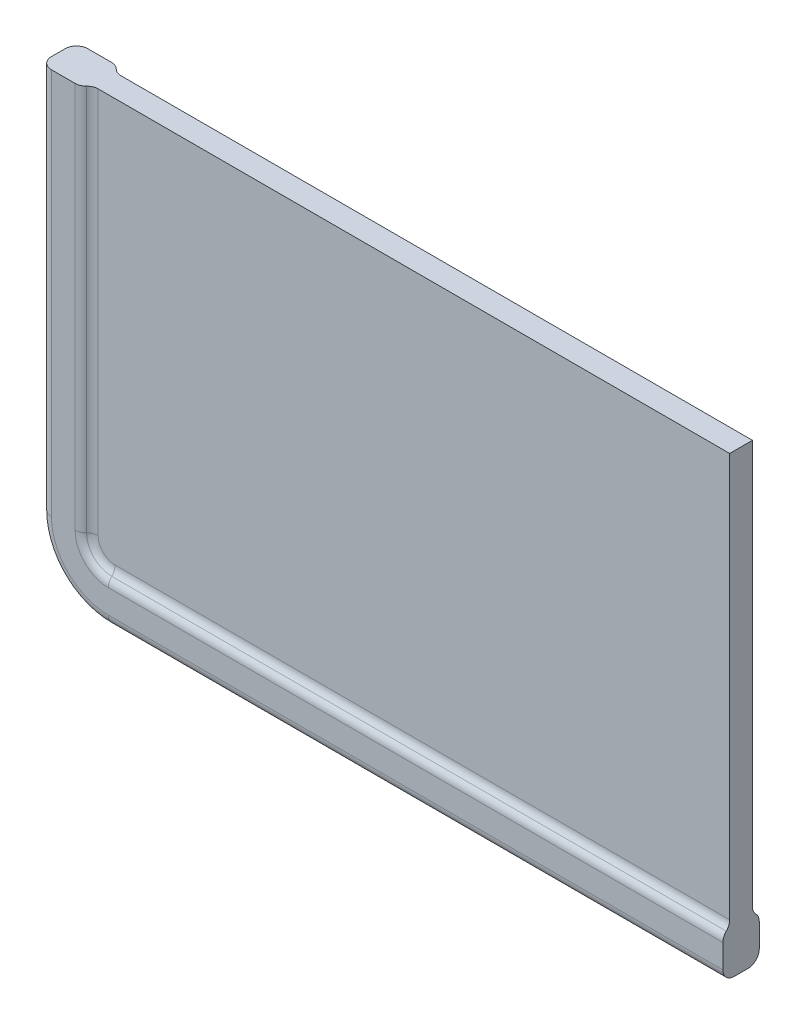
ISO-10303-21;
HEADER;
FILE_DESCRIPTION(('STEP AP214'),'2;1');
FILE_NAME('part.step','',(''),(''),'','','');
FILE_SCHEMA(('AUTOMOTIVE_DESIGN { 1 0 10303 214 1 1 1 1 }'));
ENDSEC;
DATA;
#1=APPLICATION_CONTEXT('core data for automotive mechanical design processes');
#2=APPLICATION_PROTOCOL_DEFINITION('international standard','automotive_design',2000,#1);
#3=PRODUCT_CONTEXT('',#1,'mechanical');
#4=PRODUCT('Part','Part','',(#3));
#5=PRODUCT_RELATED_PRODUCT_CATEGORY('part','',(#4));
#6=PRODUCT_DEFINITION_FORMATION('','',#4);
#7=PRODUCT_DEFINITION_CONTEXT('part definition',#1,'design');
#8=PRODUCT_DEFINITION('design','',#6,#7);
#9=PRODUCT_DEFINITION_SHAPE('','',#8);
#10=(LENGTH_UNIT() NAMED_UNIT(*) SI_UNIT(.MILLI.,.METRE.));
#11=(NAMED_UNIT(*) PLANE_ANGLE_UNIT() SI_UNIT($,.RADIAN.));
#12=(NAMED_UNIT(*) SI_UNIT($,.STERADIAN.) SOLID_ANGLE_UNIT());
#13=UNCERTAINTY_MEASURE_WITH_UNIT(LENGTH_MEASURE(1.E-05),#10,'distance_accuracy_value','');
#14=(GEOMETRIC_REPRESENTATION_CONTEXT(3) GLOBAL_UNCERTAINTY_ASSIGNED_CONTEXT((#13)) GLOBAL_UNIT_ASSIGNED_CONTEXT((#10,
#11,#12)) REPRESENTATION_CONTEXT('',''));
#15=CARTESIAN_POINT('',(0.,0.,0.));
#16=DIRECTION('',(0.,0.,1.));
#17=DIRECTION('',(1.,0.,0.));
#18=AXIS2_PLACEMENT_3D('',#15,#16,#17);
#19=CARTESIAN_POINT('',(0.,0.,0.));
#20=DIRECTION('',(0.,1.,0.));
#21=DIRECTION('',(0.,0.,1.));
#22=AXIS2_PLACEMENT_3D('',#19,#20,#21);
#23=PLANE('',#22);
#24=CARTESIAN_POINT('',(-176.175128514172,0.,6.35));
#25=DIRECTION('',(0.,1.,0.));
#26=DIRECTION('',(0.,0.,1.));
#27=AXIS2_PLACEMENT_3D('',#24,#25,#26);
#28=CIRCLE('',#27,3.175);
#29=CARTESIAN_POINT('',(-178.442532040235,0.,4.12749999999999));
#30=VERTEX_POINT('',#29);
#31=CARTESIAN_POINT('',(-176.175128514172,0.,3.175));
#32=VERTEX_POINT('',#31);
#33=EDGE_CURVE('E221',#30,#32,#28,.F.);
#34=ORIENTED_EDGE('',*,*,#33,.T.);
#35=DIRECTION('',(1.,0.,0.));
#36=VECTOR('',#35,1.);
#37=CARTESIAN_POINT('',(0.,0.,3.175));
#38=LINE('',#37,#36);
#39=CARTESIAN_POINT('',(0.,0.,3.175));
#40=VERTEX_POINT('',#39);
#41=EDGE_CURVE('E223',#32,#40,#38,.T.);
#42=ORIENTED_EDGE('',*,*,#41,.T.);
#43=DIRECTION('',(0.,0.,-1.));
#44=VECTOR('',#43,1.);
#45=CARTESIAN_POINT('',(0.,0.,0.));
#46=LINE('',#45,#44);
#47=CARTESIAN_POINT('',(0.,0.,-3.175));
#48=VERTEX_POINT('',#47);
#49=EDGE_CURVE('E45',#40,#48,#46,.T.);
#50=ORIENTED_EDGE('',*,*,#49,.T.);
#51=DIRECTION('',(1.,0.,0.));
#52=VECTOR('',#51,1.);
#53=CARTESIAN_POINT('',(0.,0.,-3.175));
#54=LINE('',#53,#52);
#55=CARTESIAN_POINT('',(-176.175128514172,0.,-3.175));
#56=VERTEX_POINT('',#55);
#57=EDGE_CURVE('E213',#56,#48,#54,.T.);
#58=ORIENTED_EDGE('',*,*,#57,.F.);
#59=CARTESIAN_POINT('',(-176.175128514172,0.,-6.35));
#60=DIRECTION('',(0.,1.,0.));
#61=DIRECTION('',(0.,0.,1.));
#62=AXIS2_PLACEMENT_3D('',#59,#60,#61);
#63=CIRCLE('',#62,3.175);
#64=CARTESIAN_POINT('',(-178.442532040235,0.,-4.12749999999999));
#65=VERTEX_POINT('',#64);
#66=EDGE_CURVE('E191',#56,#65,#63,.F.);
#67=ORIENTED_EDGE('',*,*,#66,.T.);
#68=CARTESIAN_POINT('',(-180.709935566297,0.,-1.905));
#69=DIRECTION('',(0.,1.,0.));
#70=DIRECTION('',(0.,0.,1.));
#71=AXIS2_PLACEMENT_3D('',#68,#69,#70);
#72=CIRCLE('',#71,3.175);
#73=CARTESIAN_POINT('',(-180.709935566297,0.,-5.08));
#74=VERTEX_POINT('',#73);
#75=EDGE_CURVE('E200',#74,#65,#72,.F.);
#76=ORIENTED_EDGE('',*,*,#75,.F.);
#77=DIRECTION('',(1.,0.,0.));
#78=VECTOR('',#77,1.);
#79=CARTESIAN_POINT('',(171.45,0.,-5.08));
#80=LINE('',#79,#78);
#81=CARTESIAN_POINT('',(-187.325,0.,-5.08));
#82=VERTEX_POINT('',#81);
#83=EDGE_CURVE('E236',#82,#74,#80,.T.);
#84=ORIENTED_EDGE('',*,*,#83,.F.);
#85=CARTESIAN_POINT('',(-187.325,0.,-1.905));
#86=DIRECTION('',(0.,1.,0.));
#87=DIRECTION('',(0.,0.,1.));
#88=AXIS2_PLACEMENT_3D('',#85,#86,#87);
#89=CIRCLE('',#88,3.175);
#90=CARTESIAN_POINT('',(-190.5,0.,-1.905));
#91=VERTEX_POINT('',#90);
#92=EDGE_CURVE('E244',#91,#82,#89,.F.);
#93=ORIENTED_EDGE('',*,*,#92,.F.);
#94=DIRECTION('',(0.,0.,1.));
#95=VECTOR('',#94,1.);
#96=CARTESIAN_POINT('',(-190.5,0.,3.175));
#97=LINE('',#96,#95);
#98=CARTESIAN_POINT('',(-190.5,0.,1.905));
#99=VERTEX_POINT('',#98);
#100=EDGE_CURVE('E227',#91,#99,#97,.T.);
#101=ORIENTED_EDGE('',*,*,#100,.T.);
#102=CARTESIAN_POINT('',(-187.325,0.,1.905));
#103=DIRECTION('',(0.,1.,0.));
#104=DIRECTION('',(0.,0.,1.));
#105=AXIS2_PLACEMENT_3D('',#102,#103,#104);
#106=CIRCLE('',#105,3.175);
#107=CARTESIAN_POINT('',(-187.325,0.,5.08));
#108=VERTEX_POINT('',#107);
#109=EDGE_CURVE('E241',#108,#99,#106,.F.);
#110=ORIENTED_EDGE('',*,*,#109,.F.);
#111=DIRECTION('',(-1.,0.,0.));
#112=VECTOR('',#111,1.);
#113=CARTESIAN_POINT('',(171.45,0.,5.08));
#114=LINE('',#113,#112);
#115=CARTESIAN_POINT('',(-180.709935566297,0.,5.08));
#116=VERTEX_POINT('',#115);
#117=EDGE_CURVE('E232',#116,#108,#114,.T.);
#118=ORIENTED_EDGE('',*,*,#117,.F.);
#119=CARTESIAN_POINT('',(-180.709935566297,0.,1.905));
#120=DIRECTION('',(0.,1.,0.));
#121=DIRECTION('',(0.,0.,1.));
#122=AXIS2_PLACEMENT_3D('',#119,#120,#121);
#123=CIRCLE('',#122,3.175);
#124=EDGE_CURVE('E197',#30,#116,#123,.F.);
#125=ORIENTED_EDGE('',*,*,#124,.F.);
#126=EDGE_LOOP('',(#34,#42,#50,#58,#67,#76,#84,#93,#101,#110,#118,#125));
#127=FACE_BOUND('',#126,.T.);
#128=ADVANCED_FACE('F41',(#127),#23,.T.);
#129=CARTESIAN_POINT('',(0.,0.,0.));
#130=DIRECTION('',(1.,0.,0.));
#131=DIRECTION('',(0.,0.,-1.));
#132=AXIS2_PLACEMENT_3D('',#129,#130,#131);
#133=PLANE('',#132);
#134=ORIENTED_EDGE('',*,*,#49,.F.);
#135=DIRECTION('',(0.,-1.,0.));
#136=VECTOR('',#135,1.);
#137=CARTESIAN_POINT('',(0.,0.,3.175));
#138=LINE('',#137,#136);
#139=CARTESIAN_POINT('',(0.,-112.675128514172,3.175));
#140=VERTEX_POINT('',#139);
#141=EDGE_CURVE('E226',#40,#140,#138,.T.);
#142=ORIENTED_EDGE('',*,*,#141,.T.);
#143=CARTESIAN_POINT('',(0.,-112.675128514172,6.35));
#144=DIRECTION('',(1.,0.,0.));
#145=DIRECTION('',(0.,0.,-1.));
#146=AXIS2_PLACEMENT_3D('',#143,#144,#145);
#147=CIRCLE('',#146,3.175);
#148=CARTESIAN_POINT('',(0.,-114.942532040235,4.1275));
#149=VERTEX_POINT('',#148);
#150=EDGE_CURVE('E217',#140,#149,#147,.F.);
#151=ORIENTED_EDGE('',*,*,#150,.T.);
#152=CARTESIAN_POINT('',(0.,-117.209935566297,1.905));
#153=DIRECTION('',(1.,0.,0.));
#154=DIRECTION('',(0.,0.,-1.));
#155=AXIS2_PLACEMENT_3D('',#152,#153,#154);
#156=CIRCLE('',#155,3.175);
#157=CARTESIAN_POINT('',(0.,-117.209935566297,5.08));
#158=VERTEX_POINT('',#157);
#159=EDGE_CURVE('E206',#158,#149,#156,.F.);
#160=ORIENTED_EDGE('',*,*,#159,.F.);
#161=DIRECTION('',(0.,1.,0.));
#162=VECTOR('',#161,1.);
#163=CARTESIAN_POINT('',(0.,107.95,5.08));
#164=LINE('',#163,#162);
#165=CARTESIAN_POINT('',(0.,-123.825,5.08));
#166=VERTEX_POINT('',#165);
#167=EDGE_CURVE('E230',#166,#158,#164,.T.);
#168=ORIENTED_EDGE('',*,*,#167,.F.);
#169=CARTESIAN_POINT('',(0.,-123.825,1.905));
#170=DIRECTION('',(1.,0.,0.));
#171=DIRECTION('',(0.,0.,-1.));
#172=AXIS2_PLACEMENT_3D('',#169,#170,#171);
#173=CIRCLE('',#172,3.175);
#174=CARTESIAN_POINT('',(0.,-127.,1.905));
#175=VERTEX_POINT('',#174);
#176=EDGE_CURVE('E240',#175,#166,#173,.F.);
#177=ORIENTED_EDGE('',*,*,#176,.F.);
#178=DIRECTION('',(0.,0.,-1.));
#179=VECTOR('',#178,1.);
#180=CARTESIAN_POINT('',(0.,-127.,3.175));
#181=LINE('',#180,#179);
#182=CARTESIAN_POINT('',(0.,-127.,-1.905));
#183=VERTEX_POINT('',#182);
#184=EDGE_CURVE('E231',#175,#183,#181,.T.);
#185=ORIENTED_EDGE('',*,*,#184,.T.);
#186=CARTESIAN_POINT('',(0.,-123.825,-1.905));
#187=DIRECTION('',(1.,0.,0.));
#188=DIRECTION('',(0.,0.,-1.));
#189=AXIS2_PLACEMENT_3D('',#186,#187,#188);
#190=CIRCLE('',#189,3.175);
#191=CARTESIAN_POINT('',(0.,-123.825,-5.08));
#192=VERTEX_POINT('',#191);
#193=EDGE_CURVE('E243',#192,#183,#190,.F.);
#194=ORIENTED_EDGE('',*,*,#193,.F.);
#195=DIRECTION('',(0.,-1.,0.));
#196=VECTOR('',#195,1.);
#197=CARTESIAN_POINT('',(0.,107.95,-5.08));
#198=LINE('',#197,#196);
#199=CARTESIAN_POINT('',(0.,-117.209935566297,-5.08));
#200=VERTEX_POINT('',#199);
#201=EDGE_CURVE('E235',#200,#192,#198,.T.);
#202=ORIENTED_EDGE('',*,*,#201,.F.);
#203=CARTESIAN_POINT('',(0.,-117.209935566297,-1.905));
#204=DIRECTION('',(1.,0.,0.));
#205=DIRECTION('',(0.,0.,-1.));
#206=AXIS2_PLACEMENT_3D('',#203,#204,#205);
#207=CIRCLE('',#206,3.175);
#208=CARTESIAN_POINT('',(0.,-114.942532040235,-4.1275));
#209=VERTEX_POINT('',#208);
#210=EDGE_CURVE('E207',#209,#200,#207,.F.);
#211=ORIENTED_EDGE('',*,*,#210,.F.);
#212=CARTESIAN_POINT('',(0.,-112.675128514172,-6.35));
#213=DIRECTION('',(1.,0.,0.));
#214=DIRECTION('',(0.,0.,-1.));
#215=AXIS2_PLACEMENT_3D('',#212,#213,#214);
#216=CIRCLE('',#215,3.175);
#217=CARTESIAN_POINT('',(0.,-112.675128514172,-3.175));
#218=VERTEX_POINT('',#217);
#219=EDGE_CURVE('E214',#209,#218,#216,.F.);
#220=ORIENTED_EDGE('',*,*,#219,.T.);
#221=DIRECTION('',(0.,-1.,0.));
#222=VECTOR('',#221,1.);
#223=CARTESIAN_POINT('',(0.,0.,-3.175));
#224=LINE('',#223,#222);
#225=EDGE_CURVE('E238',#48,#218,#224,.T.);
#226=ORIENTED_EDGE('',*,*,#225,.F.);
#227=EDGE_LOOP('',(#134,#142,#151,#160,#168,#177,#185,#194,#202,#211,#220,#226));
#228=FACE_BOUND('',#227,.T.);
#229=ADVANCED_FACE('F379',(#228),#133,.T.);
#230=CARTESIAN_POINT('',(-190.5,-127.,3.175));
#231=DIRECTION('',(1.,0.,0.));
#232=DIRECTION('',(0.,0.,-1.));
#233=AXIS2_PLACEMENT_3D('',#230,#231,#232);
#234=PLANE('',#233);
#235=ORIENTED_EDGE('',*,*,#100,.F.);
#236=DIRECTION('',(0.,-1.,0.));
#237=VECTOR('',#236,1.);
#238=CARTESIAN_POINT('',(-190.5,-107.95,-1.905));
#239=LINE('',#238,#237);
#240=CARTESIAN_POINT('',(-190.5,-107.95,-1.905));
#241=VERTEX_POINT('',#240);
#242=EDGE_CURVE('E306',#91,#241,#239,.T.);
#243=ORIENTED_EDGE('',*,*,#242,.T.);
#244=DIRECTION('',(0.,0.,-1.));
#245=VECTOR('',#244,1.);
#246=CARTESIAN_POINT('',(-190.5,-107.95,3.175));
#247=LINE('',#246,#245);
#248=CARTESIAN_POINT('',(-190.5,-107.95,1.905));
#249=VERTEX_POINT('',#248);
#250=EDGE_CURVE('E304',#241,#249,#247,.F.);
#251=ORIENTED_EDGE('',*,*,#250,.T.);
#252=DIRECTION('',(0.,-1.,0.));
#253=VECTOR('',#252,1.);
#254=CARTESIAN_POINT('',(-190.5,95.25,1.905));
#255=LINE('',#254,#253);
#256=EDGE_CURVE('E309',#249,#99,#255,.F.);
#257=ORIENTED_EDGE('',*,*,#256,.T.);
#258=EDGE_LOOP('',(#235,#243,#251,#257));
#259=FACE_BOUND('',#258,.T.);
#260=ADVANCED_FACE('F400',(#259),#234,.F.);
#261=CARTESIAN_POINT('',(-190.5,-127.,3.175));
#262=DIRECTION('',(0.,1.,0.));
#263=DIRECTION('',(0.,0.,1.));
#264=AXIS2_PLACEMENT_3D('',#261,#262,#263);
#265=PLANE('',#264);
#266=ORIENTED_EDGE('',*,*,#184,.F.);
#267=DIRECTION('',(1.,0.,0.));
#268=VECTOR('',#267,1.);
#269=CARTESIAN_POINT('',(-171.45,-127.,1.905));
#270=LINE('',#269,#268);
#271=CARTESIAN_POINT('',(-171.45,-127.,1.905));
#272=VERTEX_POINT('',#271);
#273=EDGE_CURVE('E290',#175,#272,#270,.F.);
#274=ORIENTED_EDGE('',*,*,#273,.T.);
#275=DIRECTION('',(0.,0.,-1.));
#276=VECTOR('',#275,1.);
#277=CARTESIAN_POINT('',(-171.45,-127.,3.175));
#278=LINE('',#277,#276);
#279=CARTESIAN_POINT('',(-171.45,-127.,-1.905));
#280=VERTEX_POINT('',#279);
#281=EDGE_CURVE('E255',#272,#280,#278,.T.);
#282=ORIENTED_EDGE('',*,*,#281,.T.);
#283=DIRECTION('',(1.,0.,0.));
#284=VECTOR('',#283,1.);
#285=CARTESIAN_POINT('',(158.75,-127.,-1.905));
#286=LINE('',#285,#284);
#287=EDGE_CURVE('E292',#280,#183,#286,.T.);
#288=ORIENTED_EDGE('',*,*,#287,.T.);
#289=EDGE_LOOP('',(#266,#274,#282,#288));
#290=FACE_BOUND('',#289,.T.);
#291=ADVANCED_FACE('F363',(#290),#265,.F.);
#292=CARTESIAN_POINT('',(171.45,107.95,5.08));
#293=DIRECTION('',(0.,0.,1.));
#294=DIRECTION('',(1.,0.,0.));
#295=AXIS2_PLACEMENT_3D('',#292,#293,#294);
#296=PLANE('',#295);
#297=DIRECTION('',(1.,0.,0.));
#298=VECTOR('',#297,1.);
#299=CARTESIAN_POINT('',(158.75,-123.825,5.08));
#300=LINE('',#299,#298);
#301=CARTESIAN_POINT('',(-171.45,-123.825,5.08));
#302=VERTEX_POINT('',#301);
#303=EDGE_CURVE('E296',#302,#166,#300,.T.);
#304=ORIENTED_EDGE('',*,*,#303,.T.);
#305=ORIENTED_EDGE('',*,*,#167,.T.);
#306=DIRECTION('',(1.,0.,0.));
#307=VECTOR('',#306,1.);
#308=CARTESIAN_POINT('',(-171.45,-117.209935566297,5.08));
#309=LINE('',#308,#307);
#310=CARTESIAN_POINT('',(-171.45,-117.209935566297,5.08));
#311=VERTEX_POINT('',#310);
#312=EDGE_CURVE('E63',#158,#311,#309,.F.);
#313=ORIENTED_EDGE('',*,*,#312,.T.);
#314=CARTESIAN_POINT('',(-171.45,-107.95,5.08));
#315=DIRECTION('',(0.,0.,1.));
#316=DIRECTION('',(1.,0.,0.));
#317=AXIS2_PLACEMENT_3D('',#314,#315,#316);
#318=CIRCLE('',#317,9.25993556629697);
#319=CARTESIAN_POINT('',(-180.709935566297,-107.95,5.08));
#320=VERTEX_POINT('',#319);
#321=EDGE_CURVE('E58',#311,#320,#318,.F.);
#322=ORIENTED_EDGE('',*,*,#321,.T.);
#323=DIRECTION('',(0.,-1.,0.));
#324=VECTOR('',#323,1.);
#325=CARTESIAN_POINT('',(-180.709935566297,95.25,5.08));
#326=LINE('',#325,#324);
#327=EDGE_CURVE('E302',#320,#116,#326,.F.);
#328=ORIENTED_EDGE('',*,*,#327,.T.);
#329=ORIENTED_EDGE('',*,*,#117,.T.);
#330=DIRECTION('',(0.,-1.,0.));
#331=VECTOR('',#330,1.);
#332=CARTESIAN_POINT('',(-187.325,-107.95,5.08));
#333=LINE('',#332,#331);
#334=CARTESIAN_POINT('',(-187.325,-107.95,5.08));
#335=VERTEX_POINT('',#334);
#336=EDGE_CURVE('E301',#108,#335,#333,.T.);
#337=ORIENTED_EDGE('',*,*,#336,.T.);
#338=CARTESIAN_POINT('',(-171.45,-107.95,5.08));
#339=DIRECTION('',(0.,0.,1.));
#340=DIRECTION('',(1.,0.,0.));
#341=AXIS2_PLACEMENT_3D('',#338,#339,#340);
#342=CIRCLE('',#341,15.875);
#343=EDGE_CURVE('E299',#335,#302,#342,.T.);
#344=ORIENTED_EDGE('',*,*,#343,.T.);
#345=EDGE_LOOP('',(#304,#305,#313,#322,#328,#329,#337,#344));
#346=FACE_BOUND('',#345,.T.);
#347=ADVANCED_FACE('F407',(#346),#296,.T.);
#348=CARTESIAN_POINT('',(0.,0.,3.175));
#349=DIRECTION('',(0.,0.,-1.));
#350=DIRECTION('',(-1.,0.,0.));
#351=AXIS2_PLACEMENT_3D('',#348,#349,#350);
#352=PLANE('',#351);
#353=ORIENTED_EDGE('',*,*,#141,.F.);
#354=ORIENTED_EDGE('',*,*,#41,.F.);
#355=DIRECTION('',(0.,1.,0.));
#356=VECTOR('',#355,1.);
#357=CARTESIAN_POINT('',(-176.175128514172,0.,3.175));
#358=LINE('',#357,#356);
#359=CARTESIAN_POINT('',(-176.175128514172,-107.95,3.175));
#360=VERTEX_POINT('',#359);
#361=EDGE_CURVE('E284',#32,#360,#358,.F.);
#362=ORIENTED_EDGE('',*,*,#361,.T.);
#363=CARTESIAN_POINT('',(-171.45,-107.95,3.175));
#364=DIRECTION('',(0.,0.,-1.));
#365=DIRECTION('',(-1.,0.,0.));
#366=AXIS2_PLACEMENT_3D('',#363,#364,#365);
#367=CIRCLE('',#366,4.72512851417226);
#368=CARTESIAN_POINT('',(-171.45,-112.675128514172,3.175));
#369=VERTEX_POINT('',#368);
#370=EDGE_CURVE('E280',#360,#369,#367,.F.);
#371=ORIENTED_EDGE('',*,*,#370,.T.);
#372=DIRECTION('',(-1.,0.,0.));
#373=VECTOR('',#372,1.);
#374=CARTESIAN_POINT('',(0.,-112.675128514172,3.175));
#375=LINE('',#374,#373);
#376=EDGE_CURVE('E277',#369,#140,#375,.F.);
#377=ORIENTED_EDGE('',*,*,#376,.T.);
#378=EDGE_LOOP('',(#353,#354,#362,#371,#377));
#379=FACE_BOUND('',#378,.T.);
#380=ADVANCED_FACE('F43',(#379),#352,.F.);
#381=CARTESIAN_POINT('',(171.45,107.95,-5.08));
#382=DIRECTION('',(0.,0.,-1.));
#383=DIRECTION('',(1.,0.,0.));
#384=AXIS2_PLACEMENT_3D('',#381,#382,#383);
#385=PLANE('',#384);
#386=DIRECTION('',(-1.,0.,0.));
#387=VECTOR('',#386,1.);
#388=CARTESIAN_POINT('',(158.75,-117.209935566297,-5.08));
#389=LINE('',#388,#387);
#390=CARTESIAN_POINT('',(-171.45,-117.209935566297,-5.08));
#391=VERTEX_POINT('',#390);
#392=EDGE_CURVE('E285',#391,#200,#389,.F.);
#393=ORIENTED_EDGE('',*,*,#392,.T.);
#394=ORIENTED_EDGE('',*,*,#201,.T.);
#395=DIRECTION('',(1.,0.,0.));
#396=VECTOR('',#395,1.);
#397=CARTESIAN_POINT('',(-171.45,-123.825,-5.08));
#398=LINE('',#397,#396);
#399=CARTESIAN_POINT('',(-171.45,-123.825,-5.08));
#400=VERTEX_POINT('',#399);
#401=EDGE_CURVE('E281',#192,#400,#398,.F.);
#402=ORIENTED_EDGE('',*,*,#401,.T.);
#403=CARTESIAN_POINT('',(-171.45,-107.95,-5.08));
#404=DIRECTION('',(0.,0.,-1.));
#405=DIRECTION('',(-1.,0.,0.));
#406=AXIS2_PLACEMENT_3D('',#403,#404,#405);
#407=CIRCLE('',#406,15.875);
#408=CARTESIAN_POINT('',(-187.325,-107.95,-5.08));
#409=VERTEX_POINT('',#408);
#410=EDGE_CURVE('E283',#400,#409,#407,.T.);
#411=ORIENTED_EDGE('',*,*,#410,.T.);
#412=DIRECTION('',(0.,-1.,0.));
#413=VECTOR('',#412,1.);
#414=CARTESIAN_POINT('',(-187.325,95.25,-5.08));
#415=LINE('',#414,#413);
#416=EDGE_CURVE('E289',#409,#82,#415,.F.);
#417=ORIENTED_EDGE('',*,*,#416,.T.);
#418=ORIENTED_EDGE('',*,*,#83,.T.);
#419=DIRECTION('',(0.,1.,0.));
#420=VECTOR('',#419,1.);
#421=CARTESIAN_POINT('',(-180.709935566297,-107.95,-5.08));
#422=LINE('',#421,#420);
#423=CARTESIAN_POINT('',(-180.709935566297,-107.95,-5.08));
#424=VERTEX_POINT('',#423);
#425=EDGE_CURVE('E202',#74,#424,#422,.F.);
#426=ORIENTED_EDGE('',*,*,#425,.T.);
#427=CARTESIAN_POINT('',(-171.45,-107.95,-5.08));
#428=DIRECTION('',(0.,0.,-1.));
#429=DIRECTION('',(-1.,0.,0.));
#430=AXIS2_PLACEMENT_3D('',#427,#428,#429);
#431=CIRCLE('',#430,9.25993556629697);
#432=EDGE_CURVE('E288',#424,#391,#431,.F.);
#433=ORIENTED_EDGE('',*,*,#432,.T.);
#434=EDGE_LOOP('',(#393,#394,#402,#411,#417,#418,#426,#433));
#435=FACE_BOUND('',#434,.T.);
#436=ADVANCED_FACE('F434',(#435),#385,.T.);
#437=CARTESIAN_POINT('',(0.,0.,-3.175));
#438=DIRECTION('',(0.,0.,-1.));
#439=DIRECTION('',(-1.,0.,0.));
#440=AXIS2_PLACEMENT_3D('',#437,#438,#439);
#441=PLANE('',#440);
#442=ORIENTED_EDGE('',*,*,#57,.T.);
#443=ORIENTED_EDGE('',*,*,#225,.T.);
#444=DIRECTION('',(-1.,0.,0.));
#445=VECTOR('',#444,1.);
#446=CARTESIAN_POINT('',(-171.45,-112.675128514172,-3.175));
#447=LINE('',#446,#445);
#448=CARTESIAN_POINT('',(-171.45,-112.675128514172,-3.175));
#449=VERTEX_POINT('',#448);
#450=EDGE_CURVE('E272',#218,#449,#447,.T.);
#451=ORIENTED_EDGE('',*,*,#450,.T.);
#452=CARTESIAN_POINT('',(-171.45,-107.95,-3.175));
#453=DIRECTION('',(0.,0.,-1.));
#454=DIRECTION('',(-1.,0.,0.));
#455=AXIS2_PLACEMENT_3D('',#452,#453,#454);
#456=CIRCLE('',#455,4.72512851417226);
#457=CARTESIAN_POINT('',(-176.175128514172,-107.95,-3.175));
#458=VERTEX_POINT('',#457);
#459=EDGE_CURVE('E274',#449,#458,#456,.T.);
#460=ORIENTED_EDGE('',*,*,#459,.T.);
#461=DIRECTION('',(0.,1.,0.));
#462=VECTOR('',#461,1.);
#463=CARTESIAN_POINT('',(-176.175128514172,95.25,-3.175));
#464=LINE('',#463,#462);
#465=EDGE_CURVE('E317',#458,#56,#464,.T.);
#466=ORIENTED_EDGE('',*,*,#465,.T.);
#467=EDGE_LOOP('',(#442,#443,#451,#460,#466));
#468=FACE_BOUND('',#467,.T.);
#469=ADVANCED_FACE('F437',(#468),#441,.T.);
#470=CARTESIAN_POINT('',(171.45,-123.825,1.905));
#471=DIRECTION('',(-1.,0.,0.));
#472=DIRECTION('',(0.,0.,1.));
#473=AXIS2_PLACEMENT_3D('',#470,#471,#472);
#474=CYLINDRICAL_SURFACE('',#473,3.175);
#475=ORIENTED_EDGE('',*,*,#273,.F.);
#476=ORIENTED_EDGE('',*,*,#176,.T.);
#477=ORIENTED_EDGE('',*,*,#303,.F.);
#478=CARTESIAN_POINT('',(-171.45,-123.825,1.905));
#479=DIRECTION('',(1.,0.,0.));
#480=DIRECTION('',(0.,0.,-1.));
#481=AXIS2_PLACEMENT_3D('',#478,#479,#480);
#482=CIRCLE('',#481,3.175);
#483=EDGE_CURVE('E344',#302,#272,#482,.T.);
#484=ORIENTED_EDGE('',*,*,#483,.T.);
#485=EDGE_LOOP('',(#475,#476,#477,#484));
#486=FACE_BOUND('',#485,.T.);
#487=ADVANCED_FACE('F382',(#486),#474,.T.);
#488=CARTESIAN_POINT('',(-187.325,107.95,1.905));
#489=DIRECTION('',(0.,1.,0.));
#490=DIRECTION('',(0.,0.,1.));
#491=AXIS2_PLACEMENT_3D('',#488,#489,#490);
#492=CYLINDRICAL_SURFACE('',#491,3.175);
#493=ORIENTED_EDGE('',*,*,#336,.F.);
#494=ORIENTED_EDGE('',*,*,#109,.T.);
#495=ORIENTED_EDGE('',*,*,#256,.F.);
#496=CARTESIAN_POINT('',(-187.325,-107.95,1.905));
#497=DIRECTION('',(0.,1.,0.));
#498=DIRECTION('',(0.,0.,1.));
#499=AXIS2_PLACEMENT_3D('',#496,#497,#498);
#500=CIRCLE('',#499,3.175);
#501=EDGE_CURVE('E341',#249,#335,#500,.T.);
#502=ORIENTED_EDGE('',*,*,#501,.T.);
#503=EDGE_LOOP('',(#493,#494,#495,#502));
#504=FACE_BOUND('',#503,.T.);
#505=ADVANCED_FACE('F427',(#504),#492,.T.);
#506=CARTESIAN_POINT('',(-190.5,-123.825,-1.905));
#507=DIRECTION('',(-1.,0.,0.));
#508=DIRECTION('',(0.,0.,1.));
#509=AXIS2_PLACEMENT_3D('',#506,#507,#508);
#510=CYLINDRICAL_SURFACE('',#509,3.175);
#511=ORIENTED_EDGE('',*,*,#401,.F.);
#512=ORIENTED_EDGE('',*,*,#193,.T.);
#513=ORIENTED_EDGE('',*,*,#287,.F.);
#514=CARTESIAN_POINT('',(-171.45,-123.825,-1.905));
#515=DIRECTION('',(1.,0.,0.));
#516=DIRECTION('',(0.,0.,-1.));
#517=AXIS2_PLACEMENT_3D('',#514,#515,#516);
#518=CIRCLE('',#517,3.175);
#519=EDGE_CURVE('E338',#280,#400,#518,.T.);
#520=ORIENTED_EDGE('',*,*,#519,.T.);
#521=EDGE_LOOP('',(#511,#512,#513,#520));
#522=FACE_BOUND('',#521,.T.);
#523=ADVANCED_FACE('F375',(#522),#510,.T.);
#524=CARTESIAN_POINT('',(-187.325,-127.,-1.905));
#525=DIRECTION('',(0.,1.,0.));
#526=DIRECTION('',(0.,0.,1.));
#527=AXIS2_PLACEMENT_3D('',#524,#525,#526);
#528=CYLINDRICAL_SURFACE('',#527,3.175);
#529=ORIENTED_EDGE('',*,*,#242,.F.);
#530=ORIENTED_EDGE('',*,*,#92,.T.);
#531=ORIENTED_EDGE('',*,*,#416,.F.);
#532=CARTESIAN_POINT('',(-187.325,-107.95,-1.905));
#533=DIRECTION('',(0.,1.,0.));
#534=DIRECTION('',(0.,0.,1.));
#535=AXIS2_PLACEMENT_3D('',#532,#533,#534);
#536=CIRCLE('',#535,3.175);
#537=EDGE_CURVE('E336',#409,#241,#536,.T.);
#538=ORIENTED_EDGE('',*,*,#537,.T.);
#539=EDGE_LOOP('',(#529,#530,#531,#538));
#540=FACE_BOUND('',#539,.T.);
#541=ADVANCED_FACE('F413',(#540),#528,.T.);
#542=CARTESIAN_POINT('',(-171.45,-117.209935566297,-1.905));
#543=DIRECTION('',(1.,0.,0.));
#544=DIRECTION('',(0.,0.,-1.));
#545=AXIS2_PLACEMENT_3D('',#542,#543,#544);
#546=CYLINDRICAL_SURFACE('',#545,3.175);
#547=DIRECTION('',(1.,0.,0.));
#548=VECTOR('',#547,1.);
#549=CARTESIAN_POINT('',(-171.45,-114.942532040235,-4.1275));
#550=LINE('',#549,#548);
#551=CARTESIAN_POINT('',(-171.45,-114.942532040235,-4.1275));
#552=VERTEX_POINT('',#551);
#553=EDGE_CURVE('E270',#552,#209,#550,.T.);
#554=ORIENTED_EDGE('',*,*,#553,.T.);
#555=ORIENTED_EDGE('',*,*,#210,.T.);
#556=ORIENTED_EDGE('',*,*,#392,.F.);
#557=CARTESIAN_POINT('',(-171.45,-117.209935566297,-1.905));
#558=DIRECTION('',(1.,0.,0.));
#559=DIRECTION('',(0.,0.,-1.));
#560=AXIS2_PLACEMENT_3D('',#557,#558,#559);
#561=CIRCLE('',#560,3.175);
#562=EDGE_CURVE('E333',#391,#552,#561,.T.);
#563=ORIENTED_EDGE('',*,*,#562,.T.);
#564=EDGE_LOOP('',(#554,#555,#556,#563));
#565=FACE_BOUND('',#564,.T.);
#566=ADVANCED_FACE('F416',(#565),#546,.T.);
#567=CARTESIAN_POINT('',(-180.709935566297,95.25,-1.905));
#568=DIRECTION('',(0.,-1.,0.));
#569=DIRECTION('',(0.,0.,-1.));
#570=AXIS2_PLACEMENT_3D('',#567,#568,#569);
#571=CYLINDRICAL_SURFACE('',#570,3.175);
#572=ORIENTED_EDGE('',*,*,#425,.F.);
#573=ORIENTED_EDGE('',*,*,#75,.T.);
#574=DIRECTION('',(0.,-1.,0.));
#575=VECTOR('',#574,1.);
#576=CARTESIAN_POINT('',(-178.442532040235,95.25,-4.12749999999999));
#577=LINE('',#576,#575);
#578=CARTESIAN_POINT('',(-178.442532040235,-107.95,-4.12750000000001));
#579=VERTEX_POINT('',#578);
#580=EDGE_CURVE('E186',#65,#579,#577,.T.);
#581=ORIENTED_EDGE('',*,*,#580,.T.);
#582=CARTESIAN_POINT('',(-180.709935566297,-107.95,-1.905));
#583=DIRECTION('',(0.,1.,0.));
#584=DIRECTION('',(0.,0.,1.));
#585=AXIS2_PLACEMENT_3D('',#582,#583,#584);
#586=CIRCLE('',#585,3.175);
#587=EDGE_CURVE('E329',#579,#424,#586,.T.);
#588=ORIENTED_EDGE('',*,*,#587,.T.);
#589=EDGE_LOOP('',(#572,#573,#581,#588));
#590=FACE_BOUND('',#589,.T.);
#591=ADVANCED_FACE('F201',(#590),#571,.T.);
#592=CARTESIAN_POINT('',(-171.45,-117.209935566297,1.905));
#593=DIRECTION('',(-1.,0.,0.));
#594=DIRECTION('',(0.,0.,1.));
#595=AXIS2_PLACEMENT_3D('',#592,#593,#594);
#596=CYLINDRICAL_SURFACE('',#595,3.175);
#597=ORIENTED_EDGE('',*,*,#312,.F.);
#598=ORIENTED_EDGE('',*,*,#159,.T.);
#599=DIRECTION('',(-1.,0.,0.));
#600=VECTOR('',#599,1.);
#601=CARTESIAN_POINT('',(-171.45,-114.942532040235,4.1275));
#602=LINE('',#601,#600);
#603=CARTESIAN_POINT('',(-171.45,-114.942532040235,4.12750000000001));
#604=VERTEX_POINT('',#603);
#605=EDGE_CURVE('E275',#149,#604,#602,.T.);
#606=ORIENTED_EDGE('',*,*,#605,.T.);
#607=CARTESIAN_POINT('',(-171.45,-117.209935566297,1.905));
#608=DIRECTION('',(1.,0.,0.));
#609=DIRECTION('',(0.,0.,-1.));
#610=AXIS2_PLACEMENT_3D('',#607,#608,#609);
#611=CIRCLE('',#610,3.175);
#612=EDGE_CURVE('E326',#604,#311,#611,.T.);
#613=ORIENTED_EDGE('',*,*,#612,.T.);
#614=EDGE_LOOP('',(#597,#598,#606,#613));
#615=FACE_BOUND('',#614,.T.);
#616=ADVANCED_FACE('F422',(#615),#596,.T.);
#617=CARTESIAN_POINT('',(-180.709935566297,95.25,1.905));
#618=DIRECTION('',(0.,1.,0.));
#619=DIRECTION('',(0.,0.,1.));
#620=AXIS2_PLACEMENT_3D('',#617,#618,#619);
#621=CYLINDRICAL_SURFACE('',#620,3.175);
#622=DIRECTION('',(0.,1.,0.));
#623=VECTOR('',#622,1.);
#624=CARTESIAN_POINT('',(-178.442532040235,95.25,4.12749999999999));
#625=LINE('',#624,#623);
#626=CARTESIAN_POINT('',(-178.442532040235,-107.95,4.12749999999999));
#627=VERTEX_POINT('',#626);
#628=EDGE_CURVE('E316',#627,#30,#625,.T.);
#629=ORIENTED_EDGE('',*,*,#628,.T.);
#630=ORIENTED_EDGE('',*,*,#124,.T.);
#631=ORIENTED_EDGE('',*,*,#327,.F.);
#632=CARTESIAN_POINT('',(-180.709935566297,-107.95,1.905));
#633=DIRECTION('',(0.,1.,0.));
#634=DIRECTION('',(0.,0.,1.));
#635=AXIS2_PLACEMENT_3D('',#632,#633,#634);
#636=CIRCLE('',#635,3.175);
#637=EDGE_CURVE('E328',#320,#627,#636,.T.);
#638=ORIENTED_EDGE('',*,*,#637,.T.);
#639=EDGE_LOOP('',(#629,#630,#631,#638));
#640=FACE_BOUND('',#639,.T.);
#641=ADVANCED_FACE('F418',(#640),#621,.T.);
#642=CARTESIAN_POINT('',(-176.175128514172,95.25,6.35));
#643=DIRECTION('',(0.,1.,0.));
#644=DIRECTION('',(0.,0.,1.));
#645=AXIS2_PLACEMENT_3D('',#642,#643,#644);
#646=CYLINDRICAL_SURFACE('',#645,3.175);
#647=ORIENTED_EDGE('',*,*,#33,.F.);
#648=ORIENTED_EDGE('',*,*,#628,.F.);
#649=CARTESIAN_POINT('',(-176.175128514172,-107.95,6.35));
#650=DIRECTION('',(0.,1.,0.));
#651=DIRECTION('',(0.,0.,1.));
#652=AXIS2_PLACEMENT_3D('',#649,#650,#651);
#653=CIRCLE('',#652,3.175);
#654=EDGE_CURVE('E332',#360,#627,#653,.T.);
#655=ORIENTED_EDGE('',*,*,#654,.F.);
#656=ORIENTED_EDGE('',*,*,#361,.F.);
#657=EDGE_LOOP('',(#647,#648,#655,#656));
#658=FACE_BOUND('',#657,.T.);
#659=ADVANCED_FACE('F421',(#658),#646,.F.);
#660=CARTESIAN_POINT('',(-171.45,-112.675128514172,6.35));
#661=DIRECTION('',(-1.,0.,0.));
#662=DIRECTION('',(0.,0.,1.));
#663=AXIS2_PLACEMENT_3D('',#660,#661,#662);
#664=CYLINDRICAL_SURFACE('',#663,3.175);
#665=ORIENTED_EDGE('',*,*,#150,.F.);
#666=ORIENTED_EDGE('',*,*,#376,.F.);
#667=CARTESIAN_POINT('',(-171.45,-112.675128514172,6.35));
#668=DIRECTION('',(-1.,0.,0.));
#669=DIRECTION('',(0.,0.,1.));
#670=AXIS2_PLACEMENT_3D('',#667,#668,#669);
#671=CIRCLE('',#670,3.175);
#672=EDGE_CURVE('E465',#369,#604,#671,.T.);
#673=ORIENTED_EDGE('',*,*,#672,.T.);
#674=ORIENTED_EDGE('',*,*,#605,.F.);
#675=EDGE_LOOP('',(#665,#666,#673,#674));
#676=FACE_BOUND('',#675,.T.);
#677=ADVANCED_FACE('F425',(#676),#664,.F.);
#678=CARTESIAN_POINT('',(-171.45,-112.675128514172,-6.35));
#679=DIRECTION('',(1.,0.,0.));
#680=DIRECTION('',(0.,0.,-1.));
#681=AXIS2_PLACEMENT_3D('',#678,#679,#680);
#682=CYLINDRICAL_SURFACE('',#681,3.175);
#683=ORIENTED_EDGE('',*,*,#219,.F.);
#684=ORIENTED_EDGE('',*,*,#553,.F.);
#685=CARTESIAN_POINT('',(-171.45,-112.675128514172,-6.35));
#686=DIRECTION('',(-1.,0.,0.));
#687=DIRECTION('',(0.,0.,1.));
#688=AXIS2_PLACEMENT_3D('',#685,#686,#687);
#689=CIRCLE('',#688,3.175);
#690=EDGE_CURVE('E50',#552,#449,#689,.T.);
#691=ORIENTED_EDGE('',*,*,#690,.T.);
#692=ORIENTED_EDGE('',*,*,#450,.F.);
#693=EDGE_LOOP('',(#683,#684,#691,#692));
#694=FACE_BOUND('',#693,.T.);
#695=ADVANCED_FACE('F397',(#694),#682,.F.);
#696=CARTESIAN_POINT('',(-176.175128514172,95.25,-6.35));
#697=DIRECTION('',(0.,-1.,0.));
#698=DIRECTION('',(0.,0.,-1.));
#699=AXIS2_PLACEMENT_3D('',#696,#697,#698);
#700=CYLINDRICAL_SURFACE('',#699,3.175);
#701=ORIENTED_EDGE('',*,*,#66,.F.);
#702=ORIENTED_EDGE('',*,*,#465,.F.);
#703=CARTESIAN_POINT('',(-176.175128514172,-107.95,-6.35));
#704=DIRECTION('',(0.,-1.,0.));
#705=DIRECTION('',(0.,0.,-1.));
#706=AXIS2_PLACEMENT_3D('',#703,#704,#705);
#707=CIRCLE('',#706,3.175);
#708=EDGE_CURVE('E11',#458,#579,#707,.T.);
#709=ORIENTED_EDGE('',*,*,#708,.T.);
#710=ORIENTED_EDGE('',*,*,#580,.F.);
#711=EDGE_LOOP('',(#701,#702,#709,#710));
#712=FACE_BOUND('',#711,.T.);
#713=ADVANCED_FACE('F188',(#712),#700,.F.);
#714=CARTESIAN_POINT('',(-171.45,-107.95,3.175));
#715=DIRECTION('',(0.,0.,-1.));
#716=DIRECTION('',(-1.,0.,0.));
#717=AXIS2_PLACEMENT_3D('',#714,#715,#716);
#718=CYLINDRICAL_SURFACE('',#717,19.05);
#719=ORIENTED_EDGE('',*,*,#281,.F.);
#720=CARTESIAN_POINT('',(-171.45,-107.95,1.905));
#721=DIRECTION('',(0.,0.,1.));
#722=DIRECTION('',(1.,0.,0.));
#723=AXIS2_PLACEMENT_3D('',#720,#721,#722);
#724=CIRCLE('',#723,19.05);
#725=EDGE_CURVE('E308',#272,#249,#724,.F.);
#726=ORIENTED_EDGE('',*,*,#725,.T.);
#727=ORIENTED_EDGE('',*,*,#250,.F.);
#728=CARTESIAN_POINT('',(-171.45,-107.95,-1.905));
#729=DIRECTION('',(0.,0.,-1.));
#730=DIRECTION('',(-1.,0.,0.));
#731=AXIS2_PLACEMENT_3D('',#728,#729,#730);
#732=CIRCLE('',#731,19.05);
#733=EDGE_CURVE('E293',#241,#280,#732,.F.);
#734=ORIENTED_EDGE('',*,*,#733,.T.);
#735=EDGE_LOOP('',(#719,#726,#727,#734));
#736=FACE_BOUND('',#735,.T.);
#737=ADVANCED_FACE('F389',(#736),#718,.T.);
#738=CARTESIAN_POINT('',(-171.45,-107.95,1.905));
#739=DIRECTION('',(0.,0.,1.));
#740=DIRECTION('',(1.,0.,0.));
#741=AXIS2_PLACEMENT_3D('',#738,#739,#740);
#742=TOROIDAL_SURFACE('',#741,15.875,3.175);
#743=ORIENTED_EDGE('',*,*,#501,.F.);
#744=ORIENTED_EDGE('',*,*,#725,.F.);
#745=ORIENTED_EDGE('',*,*,#483,.F.);
#746=ORIENTED_EDGE('',*,*,#343,.F.);
#747=EDGE_LOOP('',(#743,#744,#745,#746));
#748=FACE_BOUND('',#747,.T.);
#749=ADVANCED_FACE('F387',(#748),#742,.T.);
#750=CARTESIAN_POINT('',(-171.45,-107.95,-1.905));
#751=DIRECTION('',(0.,0.,-1.));
#752=DIRECTION('',(-1.,0.,0.));
#753=AXIS2_PLACEMENT_3D('',#750,#751,#752);
#754=TOROIDAL_SURFACE('',#753,15.875,3.175);
#755=ORIENTED_EDGE('',*,*,#537,.F.);
#756=ORIENTED_EDGE('',*,*,#410,.F.);
#757=ORIENTED_EDGE('',*,*,#519,.F.);
#758=ORIENTED_EDGE('',*,*,#733,.F.);
#759=EDGE_LOOP('',(#755,#756,#757,#758));
#760=FACE_BOUND('',#759,.T.);
#761=ADVANCED_FACE('F372',(#760),#754,.T.);
#762=CARTESIAN_POINT('',(-171.45,-107.95,-1.905));
#763=DIRECTION('',(0.,0.,-1.));
#764=DIRECTION('',(-1.,0.,0.));
#765=AXIS2_PLACEMENT_3D('',#762,#763,#764);
#766=TOROIDAL_SURFACE('',#765,9.25993556629697,3.175);
#767=ORIENTED_EDGE('',*,*,#587,.F.);
#768=CARTESIAN_POINT('',(-171.45,-107.95,-4.1275));
#769=DIRECTION('',(0.,0.,1.));
#770=DIRECTION('',(1.,0.,0.));
#771=AXIS2_PLACEMENT_3D('',#768,#769,#770);
#772=CIRCLE('',#771,6.99253204023461);
#773=EDGE_CURVE('E196',#579,#552,#772,.T.);
#774=ORIENTED_EDGE('',*,*,#773,.T.);
#775=ORIENTED_EDGE('',*,*,#562,.F.);
#776=ORIENTED_EDGE('',*,*,#432,.F.);
#777=EDGE_LOOP('',(#767,#774,#775,#776));
#778=FACE_BOUND('',#777,.T.);
#779=ADVANCED_FACE('F484',(#778),#766,.T.);
#780=CARTESIAN_POINT('',(-171.45,-107.95,1.905));
#781=DIRECTION('',(0.,0.,1.));
#782=DIRECTION('',(1.,0.,0.));
#783=AXIS2_PLACEMENT_3D('',#780,#781,#782);
#784=TOROIDAL_SURFACE('',#783,9.25993556629697,3.175);
#785=ORIENTED_EDGE('',*,*,#612,.F.);
#786=CARTESIAN_POINT('',(-171.45,-107.95,4.1275));
#787=DIRECTION('',(0.,0.,-1.));
#788=DIRECTION('',(-1.,0.,0.));
#789=AXIS2_PLACEMENT_3D('',#786,#787,#788);
#790=CIRCLE('',#789,6.99253204023461);
#791=EDGE_CURVE('E278',#604,#627,#790,.T.);
#792=ORIENTED_EDGE('',*,*,#791,.T.);
#793=ORIENTED_EDGE('',*,*,#637,.F.);
#794=ORIENTED_EDGE('',*,*,#321,.F.);
#795=EDGE_LOOP('',(#785,#792,#793,#794));
#796=FACE_BOUND('',#795,.T.);
#797=ADVANCED_FACE('F469',(#796),#784,.T.);
#798=CARTESIAN_POINT('',(-171.45,-107.95,6.35));
#799=DIRECTION('',(0.,0.,1.));
#800=DIRECTION('',(1.,0.,0.));
#801=AXIS2_PLACEMENT_3D('',#798,#799,#800);
#802=TOROIDAL_SURFACE('',#801,4.72512851417226,3.175);
#803=ORIENTED_EDGE('',*,*,#654,.T.);
#804=ORIENTED_EDGE('',*,*,#791,.F.);
#805=ORIENTED_EDGE('',*,*,#672,.F.);
#806=ORIENTED_EDGE('',*,*,#370,.F.);
#807=EDGE_LOOP('',(#803,#804,#805,#806));
#808=FACE_BOUND('',#807,.T.);
#809=ADVANCED_FACE('F472',(#808),#802,.F.);
#810=CARTESIAN_POINT('',(-171.45,-107.95,-6.35));
#811=DIRECTION('',(0.,0.,1.));
#812=DIRECTION('',(1.,0.,0.));
#813=AXIS2_PLACEMENT_3D('',#810,#811,#812);
#814=TOROIDAL_SURFACE('',#813,4.72512851417226,3.175);
#815=ORIENTED_EDGE('',*,*,#708,.F.);
#816=ORIENTED_EDGE('',*,*,#459,.F.);
#817=ORIENTED_EDGE('',*,*,#690,.F.);
#818=ORIENTED_EDGE('',*,*,#773,.F.);
#819=EDGE_LOOP('',(#815,#816,#817,#818));
#820=FACE_BOUND('',#819,.T.);
#821=ADVANCED_FACE('F433',(#820),#814,.F.);
#822=CLOSED_SHELL('',(#128,#229,#260,#291,#347,#380,#436,#469,#487,#505,#523,#541,#566,#591,
#616,#641,#659,#677,#695,#713,#737,#749,#761,#779,#797,#809,#821));
#823=MANIFOLD_SOLID_BREP('B2',#822);
#824=ADVANCED_BREP_SHAPE_REPRESENTATION('',(#18,#823),#14);
#825=SHAPE_DEFINITION_REPRESENTATION(#9,#824);
ENDSEC;
END-ISO-10303-21;
